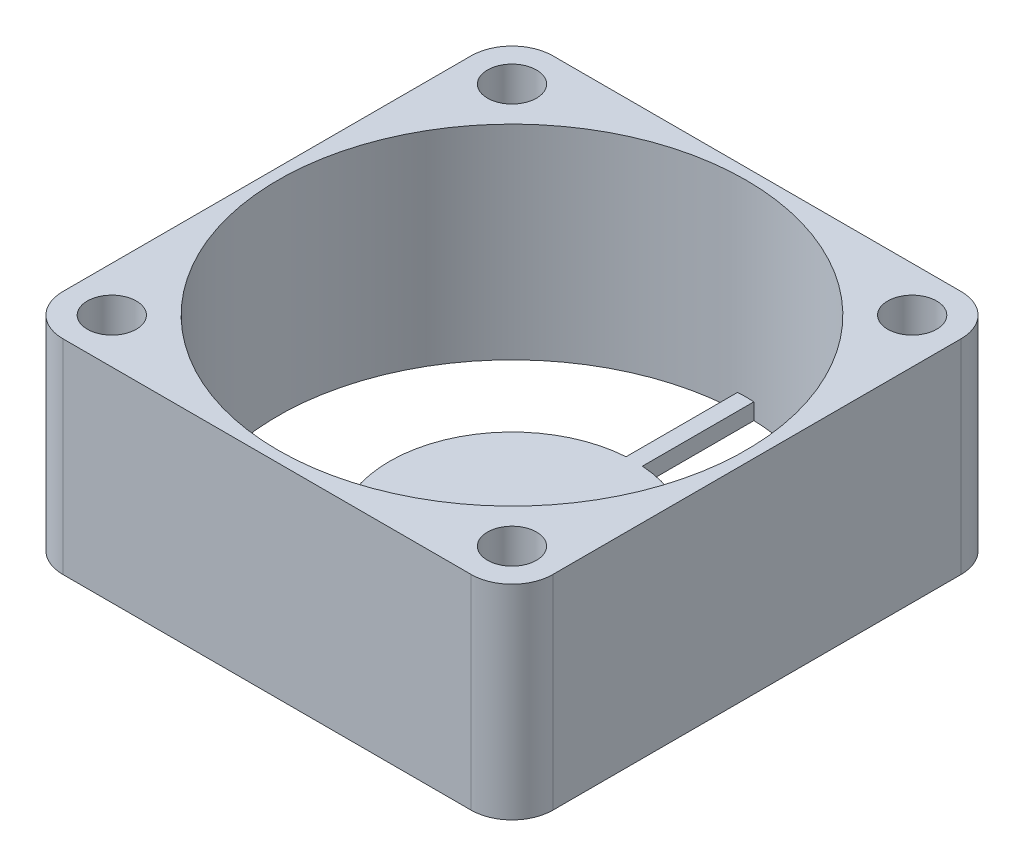
ISO-10303-21;
HEADER;
FILE_DESCRIPTION(('STEP AP214'),'2;1');
FILE_NAME('part.step','',(''),(''),'','','');
FILE_SCHEMA(('AUTOMOTIVE_DESIGN { 1 0 10303 214 1 1 1 1 }'));
ENDSEC;
DATA;
#1=APPLICATION_CONTEXT('core data for automotive mechanical design processes');
#2=APPLICATION_PROTOCOL_DEFINITION('international standard','automotive_design',2000,#1);
#3=PRODUCT_CONTEXT('',#1,'mechanical');
#4=PRODUCT('Part','Part','',(#3));
#5=PRODUCT_RELATED_PRODUCT_CATEGORY('part','',(#4));
#6=PRODUCT_DEFINITION_FORMATION('','',#4);
#7=PRODUCT_DEFINITION_CONTEXT('part definition',#1,'design');
#8=PRODUCT_DEFINITION('design','',#6,#7);
#9=PRODUCT_DEFINITION_SHAPE('','',#8);
#10=(LENGTH_UNIT() NAMED_UNIT(*) SI_UNIT(.MILLI.,.METRE.));
#11=(NAMED_UNIT(*) PLANE_ANGLE_UNIT() SI_UNIT($,.RADIAN.));
#12=(NAMED_UNIT(*) SI_UNIT($,.STERADIAN.) SOLID_ANGLE_UNIT());
#13=UNCERTAINTY_MEASURE_WITH_UNIT(LENGTH_MEASURE(1.E-05),#10,'distance_accuracy_value','');
#14=(GEOMETRIC_REPRESENTATION_CONTEXT(3) GLOBAL_UNCERTAINTY_ASSIGNED_CONTEXT((#13)) GLOBAL_UNIT_ASSIGNED_CONTEXT((#10,
#11,#12)) REPRESENTATION_CONTEXT('',''));
#15=CARTESIAN_POINT('',(0.,0.,0.));
#16=DIRECTION('',(0.,0.,1.));
#17=DIRECTION('',(1.,0.,0.));
#18=AXIS2_PLACEMENT_3D('',#15,#16,#17);
#19=CARTESIAN_POINT('',(0.,35.4678252036913,0.));
#20=DIRECTION('',(0.,-1.,0.));
#21=DIRECTION('',(0.,0.,-1.));
#22=AXIS2_PLACEMENT_3D('',#19,#20,#21);
#23=CYLINDRICAL_SURFACE('',#22,14.3241161390704);
#24=CARTESIAN_POINT('',(0.,1.,0.));
#25=DIRECTION('',(0.,1.,0.));
#26=DIRECTION('',(0.,0.,1.));
#27=AXIS2_PLACEMENT_3D('',#24,#25,#26);
#28=CIRCLE('',#27,14.3241161390704);
#29=CARTESIAN_POINT('',(0.5,1.,-14.3153869373335));
#30=VERTEX_POINT('',#29);
#31=CARTESIAN_POINT('',(-0.5,1.,-14.3153869373335));
#32=VERTEX_POINT('',#31);
#33=EDGE_CURVE('E195',#30,#32,#28,.T.);
#34=ORIENTED_EDGE('',*,*,#33,.F.);
#35=DIRECTION('',(0.,-1.,0.));
#36=VECTOR('',#35,1.);
#37=CARTESIAN_POINT('',(0.5,35.4678252036913,-14.3153869373335));
#38=LINE('',#37,#36);
#39=CARTESIAN_POINT('',(0.5,0.,-14.3153869373335));
#40=VERTEX_POINT('',#39);
#41=EDGE_CURVE('E58',#30,#40,#38,.T.);
#42=ORIENTED_EDGE('',*,*,#41,.T.);
#43=CARTESIAN_POINT('',(0.,0.,0.));
#44=DIRECTION('',(0.,1.,0.));
#45=DIRECTION('',(0.,0.,1.));
#46=AXIS2_PLACEMENT_3D('',#43,#44,#45);
#47=CIRCLE('',#46,14.3241161390704);
#48=CARTESIAN_POINT('',(-0.5,0.,-14.3153869373335));
#49=VERTEX_POINT('',#48);
#50=EDGE_CURVE('E197',#40,#49,#47,.T.);
#51=ORIENTED_EDGE('',*,*,#50,.T.);
#52=DIRECTION('',(0.,-1.,0.));
#53=VECTOR('',#52,1.);
#54=CARTESIAN_POINT('',(-0.5,35.4678252036913,-14.3153869373335));
#55=LINE('',#54,#53);
#56=EDGE_CURVE('E125',#32,#49,#55,.T.);
#57=ORIENTED_EDGE('',*,*,#56,.F.);
#58=EDGE_LOOP('',(#34,#42,#51,#57));
#59=FACE_BOUND('',#58,.T.);
#60=ADVANCED_FACE('F54',(#59),#23,.T.);
#61=CARTESIAN_POINT('',(-0.5,35.4678252036913,0.));
#62=DIRECTION('',(-1.,0.,0.));
#63=DIRECTION('',(0.,0.,1.));
#64=AXIS2_PLACEMENT_3D('',#61,#62,#63);
#65=PLANE('',#64);
#66=DIRECTION('',(0.,-1.,0.));
#67=VECTOR('',#66,1.);
#68=CARTESIAN_POINT('',(-0.5,35.4678252036913,-7.48331477354788));
#69=LINE('',#68,#67);
#70=CARTESIAN_POINT('',(-0.5,1.,-7.48331477354788));
#71=VERTEX_POINT('',#70);
#72=CARTESIAN_POINT('',(-0.5,0.,-7.48331477354788));
#73=VERTEX_POINT('',#72);
#74=EDGE_CURVE('E204',#71,#73,#69,.T.);
#75=ORIENTED_EDGE('',*,*,#74,.F.);
#76=DIRECTION('',(0.,0.,-1.));
#77=VECTOR('',#76,1.);
#78=CARTESIAN_POINT('',(-0.5,1.,0.));
#79=LINE('',#78,#77);
#80=EDGE_CURVE('E132',#71,#32,#79,.T.);
#81=ORIENTED_EDGE('',*,*,#80,.T.);
#82=ORIENTED_EDGE('',*,*,#56,.T.);
#83=DIRECTION('',(0.,0.,-1.));
#84=VECTOR('',#83,1.);
#85=CARTESIAN_POINT('',(-0.5,0.,0.));
#86=LINE('',#85,#84);
#87=EDGE_CURVE('E202',#73,#49,#86,.T.);
#88=ORIENTED_EDGE('',*,*,#87,.F.);
#89=EDGE_LOOP('',(#75,#81,#82,#88));
#90=FACE_BOUND('',#89,.T.);
#91=ADVANCED_FACE('F261',(#90),#65,.T.);
#92=CARTESIAN_POINT('',(0.,35.4678252036913,0.));
#93=DIRECTION('',(0.,-1.,0.));
#94=DIRECTION('',(0.,0.,-1.));
#95=AXIS2_PLACEMENT_3D('',#92,#93,#94);
#96=CYLINDRICAL_SURFACE('',#95,7.5);
#97=CARTESIAN_POINT('',(0.,1.,0.));
#98=DIRECTION('',(0.,1.,0.));
#99=DIRECTION('',(0.,0.,1.));
#100=AXIS2_PLACEMENT_3D('',#97,#98,#99);
#101=CIRCLE('',#100,7.5);
#102=CARTESIAN_POINT('',(-6.73074069840789,1.,3.30864468488166));
#103=VERTEX_POINT('',#102);
#104=EDGE_CURVE('E192',#71,#103,#101,.T.);
#105=ORIENTED_EDGE('',*,*,#104,.F.);
#106=ORIENTED_EDGE('',*,*,#74,.T.);
#107=CARTESIAN_POINT('',(0.,0.,0.));
#108=DIRECTION('',(0.,1.,0.));
#109=DIRECTION('',(0.,0.,1.));
#110=AXIS2_PLACEMENT_3D('',#107,#108,#109);
#111=CIRCLE('',#110,7.5);
#112=CARTESIAN_POINT('',(-6.73074069840789,0.,3.30864468488166));
#113=VERTEX_POINT('',#112);
#114=EDGE_CURVE('E206',#73,#113,#111,.T.);
#115=ORIENTED_EDGE('',*,*,#114,.T.);
#116=DIRECTION('',(0.,-1.,0.));
#117=VECTOR('',#116,1.);
#118=CARTESIAN_POINT('',(-6.73074069840789,35.4678252036913,3.30864468488166));
#119=LINE('',#118,#117);
#120=EDGE_CURVE('E207',#103,#113,#119,.T.);
#121=ORIENTED_EDGE('',*,*,#120,.F.);
#122=EDGE_LOOP('',(#105,#106,#115,#121));
#123=FACE_BOUND('',#122,.T.);
#124=ADVANCED_FACE('F231',(#123),#96,.T.);
#125=CARTESIAN_POINT('',(-0.249999999999996,35.4678252036913,-0.433012701892222));
#126=DIRECTION('',(0.499999999999992,0.,0.866025403784443));
#127=DIRECTION('',(0.866025403784443,0.,-0.499999999999992));
#128=AXIS2_PLACEMENT_3D('',#125,#126,#127);
#129=PLANE('',#128);
#130=DIRECTION('',(-0.866025403784443,0.,0.499999999999992));
#131=VECTOR('',#130,1.);
#132=CARTESIAN_POINT('',(-0.249999999999996,1.,-0.433012701892222));
#133=LINE('',#132,#131);
#134=CARTESIAN_POINT('',(-12.6474887527348,1.,6.7246807667744));
#135=VERTEX_POINT('',#134);
#136=EDGE_CURVE('E189',#103,#135,#133,.T.);
#137=ORIENTED_EDGE('',*,*,#136,.F.);
#138=ORIENTED_EDGE('',*,*,#120,.T.);
#139=DIRECTION('',(-0.866025403784443,0.,0.499999999999992));
#140=VECTOR('',#139,1.);
#141=CARTESIAN_POINT('',(-0.249999999999996,0.,-0.433012701892222));
#142=LINE('',#141,#140);
#143=CARTESIAN_POINT('',(-12.6474887527348,0.,6.7246807667744));
#144=VERTEX_POINT('',#143);
#145=EDGE_CURVE('E209',#113,#144,#142,.T.);
#146=ORIENTED_EDGE('',*,*,#145,.T.);
#147=DIRECTION('',(0.,-1.,0.));
#148=VECTOR('',#147,1.);
#149=CARTESIAN_POINT('',(-12.6474887527348,35.4678252036913,6.7246807667744));
#150=LINE('',#149,#148);
#151=EDGE_CURVE('E210',#135,#144,#150,.T.);
#152=ORIENTED_EDGE('',*,*,#151,.F.);
#153=EDGE_LOOP('',(#137,#138,#146,#152));
#154=FACE_BOUND('',#153,.T.);
#155=ADVANCED_FACE('F268',(#154),#129,.F.);
#156=CARTESIAN_POINT('',(0.,35.4678252036913,0.));
#157=DIRECTION('',(0.,-1.,0.));
#158=DIRECTION('',(0.,0.,-1.));
#159=AXIS2_PLACEMENT_3D('',#156,#157,#158);
#160=CYLINDRICAL_SURFACE('',#159,14.3241161390704);
#161=CARTESIAN_POINT('',(0.,1.,0.));
#162=DIRECTION('',(0.,1.,0.));
#163=DIRECTION('',(0.,0.,1.));
#164=AXIS2_PLACEMENT_3D('',#161,#162,#163);
#165=CIRCLE('',#164,14.3241161390704);
#166=CARTESIAN_POINT('',(-12.1474887527348,1.,7.59070617055884));
#167=VERTEX_POINT('',#166);
#168=EDGE_CURVE('E182',#135,#167,#165,.T.);
#169=ORIENTED_EDGE('',*,*,#168,.F.);
#170=ORIENTED_EDGE('',*,*,#151,.T.);
#171=CARTESIAN_POINT('',(0.,0.,0.));
#172=DIRECTION('',(0.,1.,0.));
#173=DIRECTION('',(0.,0.,1.));
#174=AXIS2_PLACEMENT_3D('',#171,#172,#173);
#175=CIRCLE('',#174,14.3241161390704);
#176=CARTESIAN_POINT('',(-12.1474887527348,0.,7.59070617055884));
#177=VERTEX_POINT('',#176);
#178=EDGE_CURVE('E186',#144,#177,#175,.T.);
#179=ORIENTED_EDGE('',*,*,#178,.T.);
#180=DIRECTION('',(0.,-1.,0.));
#181=VECTOR('',#180,1.);
#182=CARTESIAN_POINT('',(-12.1474887527348,35.4678252036913,7.59070617055884));
#183=LINE('',#182,#181);
#184=EDGE_CURVE('E185',#167,#177,#183,.T.);
#185=ORIENTED_EDGE('',*,*,#184,.F.);
#186=EDGE_LOOP('',(#169,#170,#179,#185));
#187=FACE_BOUND('',#186,.T.);
#188=ADVANCED_FACE('F271',(#187),#160,.T.);
#189=CARTESIAN_POINT('',(0.249999999999996,35.4678252036913,0.433012701892222));
#190=DIRECTION('',(0.499999999999992,0.,0.866025403784443));
#191=DIRECTION('',(0.866025403784443,0.,-0.499999999999992));
#192=AXIS2_PLACEMENT_3D('',#189,#190,#191);
#193=PLANE('',#192);
#194=DIRECTION('',(0.,-1.,0.));
#195=VECTOR('',#194,1.);
#196=CARTESIAN_POINT('',(-6.2307406984079,35.4678252036913,4.1746700886661));
#197=LINE('',#196,#195);
#198=CARTESIAN_POINT('',(-6.2307406984079,1.,4.1746700886661));
#199=VERTEX_POINT('',#198);
#200=CARTESIAN_POINT('',(-6.2307406984079,0.,4.1746700886661));
#201=VERTEX_POINT('',#200);
#202=EDGE_CURVE('E213',#199,#201,#197,.T.);
#203=ORIENTED_EDGE('',*,*,#202,.F.);
#204=DIRECTION('',(-0.866025403784443,0.,0.499999999999992));
#205=VECTOR('',#204,1.);
#206=CARTESIAN_POINT('',(0.249999999999996,1.,0.433012701892222));
#207=LINE('',#206,#205);
#208=EDGE_CURVE('E183',#199,#167,#207,.T.);
#209=ORIENTED_EDGE('',*,*,#208,.T.);
#210=ORIENTED_EDGE('',*,*,#184,.T.);
#211=DIRECTION('',(-0.866025403784443,0.,0.499999999999992));
#212=VECTOR('',#211,1.);
#213=CARTESIAN_POINT('',(0.249999999999996,0.,0.433012701892222));
#214=LINE('',#213,#212);
#215=EDGE_CURVE('E244',#201,#177,#214,.T.);
#216=ORIENTED_EDGE('',*,*,#215,.F.);
#217=EDGE_LOOP('',(#203,#209,#210,#216));
#218=FACE_BOUND('',#217,.T.);
#219=ADVANCED_FACE('F274',(#218),#193,.T.);
#220=CARTESIAN_POINT('',(0.,1.,0.));
#221=DIRECTION('',(0.,1.,0.));
#222=DIRECTION('',(0.,0.,1.));
#223=AXIS2_PLACEMENT_3D('',#220,#221,#222);
#224=CIRCLE('',#223,7.5);
#225=CARTESIAN_POINT('',(6.23074069840784,1.,4.17467008866619));
#226=VERTEX_POINT('',#225);
#227=EDGE_CURVE('E179',#199,#226,#224,.T.);
#228=ORIENTED_EDGE('',*,*,#227,.F.);
#229=ORIENTED_EDGE('',*,*,#202,.T.);
#230=CARTESIAN_POINT('',(6.23074069840784,0.,4.17467008866619));
#231=VERTEX_POINT('',#230);
#232=EDGE_CURVE('E215',#201,#231,#111,.T.);
#233=ORIENTED_EDGE('',*,*,#232,.T.);
#234=DIRECTION('',(0.,-1.,0.));
#235=VECTOR('',#234,1.);
#236=CARTESIAN_POINT('',(6.23074069840784,35.4678252036913,4.17467008866619));
#237=LINE('',#236,#235);
#238=EDGE_CURVE('E216',#226,#231,#237,.T.);
#239=ORIENTED_EDGE('',*,*,#238,.F.);
#240=EDGE_LOOP('',(#228,#229,#233,#239));
#241=FACE_BOUND('',#240,.T.);
#242=ADVANCED_FACE('F259',(#241),#96,.T.);
#243=CARTESIAN_POINT('',(-0.250000000000002,35.4678252036913,0.433012701892218));
#244=DIRECTION('',(0.500000000000004,0.,-0.866025403784436));
#245=DIRECTION('',(-0.866025403784436,0.,-0.500000000000004));
#246=AXIS2_PLACEMENT_3D('',#243,#244,#245);
#247=PLANE('',#246);
#248=DIRECTION('',(0.866025403784436,0.,0.500000000000004));
#249=VECTOR('',#248,1.);
#250=CARTESIAN_POINT('',(-0.250000000000002,1.,0.433012701892218));
#251=LINE('',#250,#249);
#252=CARTESIAN_POINT('',(12.1474887527347,1.,7.59070617055901));
#253=VERTEX_POINT('',#252);
#254=EDGE_CURVE('E177',#226,#253,#251,.T.);
#255=ORIENTED_EDGE('',*,*,#254,.F.);
#256=ORIENTED_EDGE('',*,*,#238,.T.);
#257=DIRECTION('',(0.866025403784436,0.,0.500000000000004));
#258=VECTOR('',#257,1.);
#259=CARTESIAN_POINT('',(-0.250000000000002,0.,0.433012701892218));
#260=LINE('',#259,#258);
#261=CARTESIAN_POINT('',(12.1474887527347,0.,7.59070617055901));
#262=VERTEX_POINT('',#261);
#263=EDGE_CURVE('E218',#231,#262,#260,.T.);
#264=ORIENTED_EDGE('',*,*,#263,.T.);
#265=DIRECTION('',(0.,-1.,0.));
#266=VECTOR('',#265,1.);
#267=CARTESIAN_POINT('',(12.1474887527347,35.4678252036913,7.59070617055901));
#268=LINE('',#267,#266);
#269=EDGE_CURVE('E172',#253,#262,#268,.T.);
#270=ORIENTED_EDGE('',*,*,#269,.F.);
#271=EDGE_LOOP('',(#255,#256,#264,#270));
#272=FACE_BOUND('',#271,.T.);
#273=ADVANCED_FACE('F279',(#272),#247,.F.);
#274=CARTESIAN_POINT('',(0.,35.4678252036913,0.));
#275=DIRECTION('',(0.,-1.,0.));
#276=DIRECTION('',(0.,0.,-1.));
#277=AXIS2_PLACEMENT_3D('',#274,#275,#276);
#278=CYLINDRICAL_SURFACE('',#277,14.3241161390704);
#279=CARTESIAN_POINT('',(0.,1.,0.));
#280=DIRECTION('',(0.,1.,0.));
#281=DIRECTION('',(0.,0.,1.));
#282=AXIS2_PLACEMENT_3D('',#279,#280,#281);
#283=CIRCLE('',#282,14.3241161390704);
#284=CARTESIAN_POINT('',(12.6474887527347,1.,6.72468076677458));
#285=VERTEX_POINT('',#284);
#286=EDGE_CURVE('E63',#253,#285,#283,.T.);
#287=ORIENTED_EDGE('',*,*,#286,.F.);
#288=ORIENTED_EDGE('',*,*,#269,.T.);
#289=CARTESIAN_POINT('',(0.,0.,0.));
#290=DIRECTION('',(0.,1.,0.));
#291=DIRECTION('',(0.,0.,1.));
#292=AXIS2_PLACEMENT_3D('',#289,#290,#291);
#293=CIRCLE('',#292,14.3241161390704);
#294=CARTESIAN_POINT('',(12.6474887527347,0.,6.72468076677458));
#295=VERTEX_POINT('',#294);
#296=EDGE_CURVE('E168',#262,#295,#293,.T.);
#297=ORIENTED_EDGE('',*,*,#296,.T.);
#298=DIRECTION('',(0.,-1.,0.));
#299=VECTOR('',#298,1.);
#300=CARTESIAN_POINT('',(12.6474887527347,35.4678252036913,6.72468076677458));
#301=LINE('',#300,#299);
#302=EDGE_CURVE('E164',#285,#295,#301,.T.);
#303=ORIENTED_EDGE('',*,*,#302,.F.);
#304=EDGE_LOOP('',(#287,#288,#297,#303));
#305=FACE_BOUND('',#304,.T.);
#306=ADVANCED_FACE('F282',(#305),#278,.T.);
#307=CARTESIAN_POINT('',(0.250000000000003,35.4678252036913,-0.433012701892219));
#308=DIRECTION('',(0.500000000000004,0.,-0.866025403784436));
#309=DIRECTION('',(-0.866025403784436,0.,-0.500000000000004));
#310=AXIS2_PLACEMENT_3D('',#307,#308,#309);
#311=PLANE('',#310);
#312=DIRECTION('',(0.,-1.,0.));
#313=VECTOR('',#312,1.);
#314=CARTESIAN_POINT('',(6.73074069840785,35.4678252036913,3.30864468488175));
#315=LINE('',#314,#313);
#316=CARTESIAN_POINT('',(6.73074069840785,1.,3.30864468488175));
#317=VERTEX_POINT('',#316);
#318=CARTESIAN_POINT('',(6.73074069840785,0.,3.30864468488175));
#319=VERTEX_POINT('',#318);
#320=EDGE_CURVE('E151',#317,#319,#315,.T.);
#321=ORIENTED_EDGE('',*,*,#320,.F.);
#322=DIRECTION('',(0.866025403784436,0.,0.500000000000004));
#323=VECTOR('',#322,1.);
#324=CARTESIAN_POINT('',(0.250000000000003,1.,-0.433012701892219));
#325=LINE('',#324,#323);
#326=EDGE_CURVE('E159',#317,#285,#325,.T.);
#327=ORIENTED_EDGE('',*,*,#326,.T.);
#328=ORIENTED_EDGE('',*,*,#302,.T.);
#329=DIRECTION('',(0.866025403784436,0.,0.500000000000004));
#330=VECTOR('',#329,1.);
#331=CARTESIAN_POINT('',(0.250000000000003,0.,-0.433012701892219));
#332=LINE('',#331,#330);
#333=EDGE_CURVE('E162',#319,#295,#332,.T.);
#334=ORIENTED_EDGE('',*,*,#333,.F.);
#335=EDGE_LOOP('',(#321,#327,#328,#334));
#336=FACE_BOUND('',#335,.T.);
#337=ADVANCED_FACE('F158',(#336),#311,.T.);
#338=CARTESIAN_POINT('',(0.,1.,0.));
#339=DIRECTION('',(0.,1.,0.));
#340=DIRECTION('',(0.,0.,1.));
#341=AXIS2_PLACEMENT_3D('',#338,#339,#340);
#342=CIRCLE('',#341,7.5);
#343=CARTESIAN_POINT('',(0.5,1.,-7.48331477354788));
#344=VERTEX_POINT('',#343);
#345=EDGE_CURVE('E12',#317,#344,#342,.T.);
#346=ORIENTED_EDGE('',*,*,#345,.F.);
#347=ORIENTED_EDGE('',*,*,#320,.T.);
#348=CARTESIAN_POINT('',(0.5,0.,-7.48331477354788));
#349=VERTEX_POINT('',#348);
#350=EDGE_CURVE('E163',#319,#349,#111,.T.);
#351=ORIENTED_EDGE('',*,*,#350,.T.);
#352=DIRECTION('',(0.,-1.,0.));
#353=VECTOR('',#352,1.);
#354=CARTESIAN_POINT('',(0.5,35.4678252036913,-7.48331477354788));
#355=LINE('',#354,#353);
#356=EDGE_CURVE('E76',#344,#349,#355,.T.);
#357=ORIENTED_EDGE('',*,*,#356,.F.);
#358=EDGE_LOOP('',(#346,#347,#351,#357));
#359=FACE_BOUND('',#358,.T.);
#360=ADVANCED_FACE('F150',(#359),#96,.T.);
#361=CARTESIAN_POINT('',(0.5,35.4678252036913,0.));
#362=DIRECTION('',(-1.,0.,0.));
#363=DIRECTION('',(0.,0.,1.));
#364=AXIS2_PLACEMENT_3D('',#361,#362,#363);
#365=PLANE('',#364);
#366=DIRECTION('',(0.,0.,-1.));
#367=VECTOR('',#366,1.);
#368=CARTESIAN_POINT('',(0.5,1.,0.));
#369=LINE('',#368,#367);
#370=EDGE_CURVE('E200',#344,#30,#369,.T.);
#371=ORIENTED_EDGE('',*,*,#370,.F.);
#372=ORIENTED_EDGE('',*,*,#356,.T.);
#373=DIRECTION('',(0.,0.,-1.));
#374=VECTOR('',#373,1.);
#375=CARTESIAN_POINT('',(0.5,0.,0.));
#376=LINE('',#375,#374);
#377=EDGE_CURVE('E219',#349,#40,#376,.T.);
#378=ORIENTED_EDGE('',*,*,#377,.T.);
#379=ORIENTED_EDGE('',*,*,#41,.F.);
#380=EDGE_LOOP('',(#371,#372,#378,#379));
#381=FACE_BOUND('',#380,.T.);
#382=ADVANCED_FACE('F250',(#381),#365,.F.);
#383=CARTESIAN_POINT('',(0.,0.,0.));
#384=DIRECTION('',(0.,1.,0.));
#385=DIRECTION('',(0.,0.,1.));
#386=AXIS2_PLACEMENT_3D('',#383,#384,#385);
#387=PLANE('',#386);
#388=ORIENTED_EDGE('',*,*,#50,.F.);
#389=ORIENTED_EDGE('',*,*,#377,.F.);
#390=ORIENTED_EDGE('',*,*,#350,.F.);
#391=ORIENTED_EDGE('',*,*,#333,.T.);
#392=ORIENTED_EDGE('',*,*,#296,.F.);
#393=ORIENTED_EDGE('',*,*,#263,.F.);
#394=ORIENTED_EDGE('',*,*,#232,.F.);
#395=ORIENTED_EDGE('',*,*,#215,.T.);
#396=ORIENTED_EDGE('',*,*,#178,.F.);
#397=ORIENTED_EDGE('',*,*,#145,.F.);
#398=ORIENTED_EDGE('',*,*,#114,.F.);
#399=ORIENTED_EDGE('',*,*,#87,.T.);
#400=EDGE_LOOP('',(#388,#389,#390,#391,#392,#393,#394,#395,#396,#397,#398,#399));
#401=FACE_BOUND('',#400,.T.);
#402=ADVANCED_FACE('F237',(#401),#387,.F.);
#403=CARTESIAN_POINT('',(0.,1.,0.));
#404=DIRECTION('',(0.,1.,0.));
#405=DIRECTION('',(0.,0.,1.));
#406=AXIS2_PLACEMENT_3D('',#403,#404,#405);
#407=PLANE('',#406);
#408=ORIENTED_EDGE('',*,*,#370,.T.);
#409=ORIENTED_EDGE('',*,*,#33,.T.);
#410=ORIENTED_EDGE('',*,*,#80,.F.);
#411=ORIENTED_EDGE('',*,*,#104,.T.);
#412=ORIENTED_EDGE('',*,*,#136,.T.);
#413=ORIENTED_EDGE('',*,*,#168,.T.);
#414=ORIENTED_EDGE('',*,*,#208,.F.);
#415=ORIENTED_EDGE('',*,*,#227,.T.);
#416=ORIENTED_EDGE('',*,*,#254,.T.);
#417=ORIENTED_EDGE('',*,*,#286,.T.);
#418=ORIENTED_EDGE('',*,*,#326,.F.);
#419=ORIENTED_EDGE('',*,*,#345,.T.);
#420=EDGE_LOOP('',(#408,#409,#410,#411,#412,#413,#414,#415,#416,#417,#418,#419));
#421=FACE_BOUND('',#420,.T.);
#422=ADVANCED_FACE('F56',(#421),#407,.T.);
#423=CLOSED_SHELL('',(#60,#91,#124,#155,#188,#219,#242,#273,#306,#337,#360,#382,#402,#422));
#424=MANIFOLD_SOLID_BREP('B2',#423);
#425=CARTESIAN_POINT('',(15.,12.5,0.));
#426=DIRECTION('',(1.,0.,0.));
#427=DIRECTION('',(0.,0.,-1.));
#428=AXIS2_PLACEMENT_3D('',#425,#426,#427);
#429=PLANE('',#428);
#430=DIRECTION('',(0.,0.,1.));
#431=VECTOR('',#430,1.);
#432=CARTESIAN_POINT('',(15.,0.,0.));
#433=LINE('',#432,#431);
#434=CARTESIAN_POINT('',(15.,0.,-12.5));
#435=VERTEX_POINT('',#434);
#436=CARTESIAN_POINT('',(15.,0.,12.5));
#437=VERTEX_POINT('',#436);
#438=EDGE_CURVE('E501',#435,#437,#433,.T.);
#439=ORIENTED_EDGE('',*,*,#438,.F.);
#440=DIRECTION('',(0.,-1.,0.));
#441=VECTOR('',#440,1.);
#442=CARTESIAN_POINT('',(15.,12.5,-12.5));
#443=LINE('',#442,#441);
#444=CARTESIAN_POINT('',(15.,12.5,-12.5));
#445=VERTEX_POINT('',#444);
#446=EDGE_CURVE('E523',#435,#445,#443,.F.);
#447=ORIENTED_EDGE('',*,*,#446,.T.);
#448=DIRECTION('',(0.,0.,1.));
#449=VECTOR('',#448,1.);
#450=CARTESIAN_POINT('',(15.,12.5,0.));
#451=LINE('',#450,#449);
#452=CARTESIAN_POINT('',(15.,12.5,12.5));
#453=VERTEX_POINT('',#452);
#454=EDGE_CURVE('E529',#445,#453,#451,.T.);
#455=ORIENTED_EDGE('',*,*,#454,.T.);
#456=DIRECTION('',(0.,-1.,0.));
#457=VECTOR('',#456,1.);
#458=CARTESIAN_POINT('',(15.,0.,12.5));
#459=LINE('',#458,#457);
#460=EDGE_CURVE('E520',#453,#437,#459,.T.);
#461=ORIENTED_EDGE('',*,*,#460,.T.);
#462=EDGE_LOOP('',(#439,#447,#455,#461));
#463=FACE_BOUND('',#462,.T.);
#464=ADVANCED_FACE('F404',(#463),#429,.T.);
#465=CARTESIAN_POINT('',(0.,12.5,-15.));
#466=DIRECTION('',(0.,0.,-1.));
#467=DIRECTION('',(-1.,0.,0.));
#468=AXIS2_PLACEMENT_3D('',#465,#466,#467);
#469=PLANE('',#468);
#470=DIRECTION('',(1.,0.,0.));
#471=VECTOR('',#470,1.);
#472=CARTESIAN_POINT('',(0.,0.,-15.));
#473=LINE('',#472,#471);
#474=CARTESIAN_POINT('',(-12.5,0.,-15.));
#475=VERTEX_POINT('',#474);
#476=CARTESIAN_POINT('',(12.5,0.,-15.));
#477=VERTEX_POINT('',#476);
#478=EDGE_CURVE('E497',#475,#477,#473,.T.);
#479=ORIENTED_EDGE('',*,*,#478,.F.);
#480=DIRECTION('',(0.,-1.,0.));
#481=VECTOR('',#480,1.);
#482=CARTESIAN_POINT('',(-12.5,12.5,-15.));
#483=LINE('',#482,#481);
#484=CARTESIAN_POINT('',(-12.5,12.5,-15.));
#485=VERTEX_POINT('',#484);
#486=EDGE_CURVE('E475',#475,#485,#483,.F.);
#487=ORIENTED_EDGE('',*,*,#486,.T.);
#488=DIRECTION('',(1.,0.,0.));
#489=VECTOR('',#488,1.);
#490=CARTESIAN_POINT('',(0.,12.5,-15.));
#491=LINE('',#490,#489);
#492=CARTESIAN_POINT('',(12.5,12.5,-15.));
#493=VERTEX_POINT('',#492);
#494=EDGE_CURVE('E538',#485,#493,#491,.T.);
#495=ORIENTED_EDGE('',*,*,#494,.T.);
#496=DIRECTION('',(0.,-1.,0.));
#497=VECTOR('',#496,1.);
#498=CARTESIAN_POINT('',(12.5,12.5,-15.));
#499=LINE('',#498,#497);
#500=EDGE_CURVE('E480',#493,#477,#499,.T.);
#501=ORIENTED_EDGE('',*,*,#500,.T.);
#502=EDGE_LOOP('',(#479,#487,#495,#501));
#503=FACE_BOUND('',#502,.T.);
#504=ADVANCED_FACE('F544',(#503),#469,.T.);
#505=CARTESIAN_POINT('',(-15.,12.5,0.));
#506=DIRECTION('',(1.,0.,0.));
#507=DIRECTION('',(0.,0.,-1.));
#508=AXIS2_PLACEMENT_3D('',#505,#506,#507);
#509=PLANE('',#508);
#510=DIRECTION('',(0.,0.,1.));
#511=VECTOR('',#510,1.);
#512=CARTESIAN_POINT('',(-15.,12.5,0.));
#513=LINE('',#512,#511);
#514=CARTESIAN_POINT('',(-15.,12.5,-12.5));
#515=VERTEX_POINT('',#514);
#516=CARTESIAN_POINT('',(-15.,12.5,12.5));
#517=VERTEX_POINT('',#516);
#518=EDGE_CURVE('E489',#515,#517,#513,.T.);
#519=ORIENTED_EDGE('',*,*,#518,.F.);
#520=DIRECTION('',(0.,-1.,0.));
#521=VECTOR('',#520,1.);
#522=CARTESIAN_POINT('',(-15.,0.,-12.5));
#523=LINE('',#522,#521);
#524=CARTESIAN_POINT('',(-15.,0.,-12.5));
#525=VERTEX_POINT('',#524);
#526=EDGE_CURVE('E474',#515,#525,#523,.T.);
#527=ORIENTED_EDGE('',*,*,#526,.T.);
#528=DIRECTION('',(0.,0.,1.));
#529=VECTOR('',#528,1.);
#530=CARTESIAN_POINT('',(-15.,0.,0.));
#531=LINE('',#530,#529);
#532=CARTESIAN_POINT('',(-15.,0.,12.5));
#533=VERTEX_POINT('',#532);
#534=EDGE_CURVE('E487',#525,#533,#531,.T.);
#535=ORIENTED_EDGE('',*,*,#534,.T.);
#536=DIRECTION('',(0.,-1.,0.));
#537=VECTOR('',#536,1.);
#538=CARTESIAN_POINT('',(-15.,12.5,12.5));
#539=LINE('',#538,#537);
#540=EDGE_CURVE('E491',#533,#517,#539,.F.);
#541=ORIENTED_EDGE('',*,*,#540,.T.);
#542=EDGE_LOOP('',(#519,#527,#535,#541));
#543=FACE_BOUND('',#542,.T.);
#544=ADVANCED_FACE('F486',(#543),#509,.F.);
#545=CARTESIAN_POINT('',(12.25,12.5,-12.25));
#546=DIRECTION('',(0.,-1.,0.));
#547=DIRECTION('',(0.,0.,-1.));
#548=AXIS2_PLACEMENT_3D('',#545,#546,#547);
#549=CYLINDRICAL_SURFACE('',#548,1.5);
#550=CARTESIAN_POINT('',(12.25,12.5,-12.25));
#551=DIRECTION('',(0.,1.,0.));
#552=DIRECTION('',(0.,0.,1.));
#553=AXIS2_PLACEMENT_3D('',#550,#551,#552);
#554=CIRCLE('',#553,1.5);
#555=CARTESIAN_POINT('',(12.25,12.5,-10.75));
#556=VERTEX_POINT('',#555);
#557=EDGE_CURVE('E539',#556,#556,#554,.T.);
#558=ORIENTED_EDGE('',*,*,#557,.T.);
#559=EDGE_LOOP('',(#558));
#560=FACE_BOUND('',#559,.T.);
#561=CARTESIAN_POINT('',(12.25,0.,-12.25));
#562=DIRECTION('',(0.,1.,0.));
#563=DIRECTION('',(0.,0.,1.));
#564=AXIS2_PLACEMENT_3D('',#561,#562,#563);
#565=CIRCLE('',#564,1.5);
#566=CARTESIAN_POINT('',(12.25,0.,-10.75));
#567=VERTEX_POINT('',#566);
#568=EDGE_CURVE('E545',#567,#567,#565,.T.);
#569=ORIENTED_EDGE('',*,*,#568,.F.);
#570=EDGE_LOOP('',(#569));
#571=FACE_BOUND('',#570,.T.);
#572=ADVANCED_FACE('F593',(#560,#571),#549,.F.);
#573=CARTESIAN_POINT('',(12.25,12.5,12.25));
#574=DIRECTION('',(0.,-1.,0.));
#575=DIRECTION('',(0.,0.,-1.));
#576=AXIS2_PLACEMENT_3D('',#573,#574,#575);
#577=CYLINDRICAL_SURFACE('',#576,1.5);
#578=CARTESIAN_POINT('',(12.25,12.5,12.25));
#579=DIRECTION('',(0.,1.,0.));
#580=DIRECTION('',(0.,0.,1.));
#581=AXIS2_PLACEMENT_3D('',#578,#579,#580);
#582=CIRCLE('',#581,1.5);
#583=CARTESIAN_POINT('',(12.25,12.5,13.75));
#584=VERTEX_POINT('',#583);
#585=EDGE_CURVE('E566',#584,#584,#582,.T.);
#586=ORIENTED_EDGE('',*,*,#585,.T.);
#587=EDGE_LOOP('',(#586));
#588=FACE_BOUND('',#587,.T.);
#589=CARTESIAN_POINT('',(12.25,0.,12.25));
#590=DIRECTION('',(0.,1.,0.));
#591=DIRECTION('',(0.,0.,1.));
#592=AXIS2_PLACEMENT_3D('',#589,#590,#591);
#593=CIRCLE('',#592,1.5);
#594=CARTESIAN_POINT('',(12.25,0.,13.75));
#595=VERTEX_POINT('',#594);
#596=EDGE_CURVE('E547',#595,#595,#593,.T.);
#597=ORIENTED_EDGE('',*,*,#596,.F.);
#598=EDGE_LOOP('',(#597));
#599=FACE_BOUND('',#598,.T.);
#600=ADVANCED_FACE('F596',(#588,#599),#577,.F.);
#601=CARTESIAN_POINT('',(-12.25,12.5,-12.25));
#602=DIRECTION('',(0.,-1.,0.));
#603=DIRECTION('',(0.,0.,-1.));
#604=AXIS2_PLACEMENT_3D('',#601,#602,#603);
#605=CYLINDRICAL_SURFACE('',#604,1.5);
#606=CARTESIAN_POINT('',(-12.25,12.5,-12.25));
#607=DIRECTION('',(0.,1.,0.));
#608=DIRECTION('',(0.,0.,1.));
#609=AXIS2_PLACEMENT_3D('',#606,#607,#608);
#610=CIRCLE('',#609,1.5);
#611=CARTESIAN_POINT('',(-12.25,12.5,-10.75));
#612=VERTEX_POINT('',#611);
#613=EDGE_CURVE('E569',#612,#612,#610,.T.);
#614=ORIENTED_EDGE('',*,*,#613,.T.);
#615=EDGE_LOOP('',(#614));
#616=FACE_BOUND('',#615,.T.);
#617=CARTESIAN_POINT('',(-12.25,0.,-12.25));
#618=DIRECTION('',(0.,1.,0.));
#619=DIRECTION('',(0.,0.,1.));
#620=AXIS2_PLACEMENT_3D('',#617,#618,#619);
#621=CIRCLE('',#620,1.5);
#622=CARTESIAN_POINT('',(-12.25,0.,-10.75));
#623=VERTEX_POINT('',#622);
#624=EDGE_CURVE('E552',#623,#623,#621,.T.);
#625=ORIENTED_EDGE('',*,*,#624,.F.);
#626=EDGE_LOOP('',(#625));
#627=FACE_BOUND('',#626,.T.);
#628=ADVANCED_FACE('F620',(#616,#627),#605,.F.);
#629=CARTESIAN_POINT('',(-12.25,12.5,12.25));
#630=DIRECTION('',(0.,-1.,0.));
#631=DIRECTION('',(0.,0.,-1.));
#632=AXIS2_PLACEMENT_3D('',#629,#630,#631);
#633=CYLINDRICAL_SURFACE('',#632,1.5);
#634=CARTESIAN_POINT('',(-12.25,12.5,12.25));
#635=DIRECTION('',(0.,1.,0.));
#636=DIRECTION('',(0.,0.,1.));
#637=AXIS2_PLACEMENT_3D('',#634,#635,#636);
#638=CIRCLE('',#637,1.5);
#639=CARTESIAN_POINT('',(-12.25,12.5,13.75));
#640=VERTEX_POINT('',#639);
#641=EDGE_CURVE('E572',#640,#640,#638,.T.);
#642=ORIENTED_EDGE('',*,*,#641,.T.);
#643=EDGE_LOOP('',(#642));
#644=FACE_BOUND('',#643,.T.);
#645=CARTESIAN_POINT('',(-12.25,0.,12.25));
#646=DIRECTION('',(0.,1.,0.));
#647=DIRECTION('',(0.,0.,1.));
#648=AXIS2_PLACEMENT_3D('',#645,#646,#647);
#649=CIRCLE('',#648,1.5);
#650=CARTESIAN_POINT('',(-12.25,0.,13.75));
#651=VERTEX_POINT('',#650);
#652=EDGE_CURVE('E555',#651,#651,#649,.T.);
#653=ORIENTED_EDGE('',*,*,#652,.F.);
#654=EDGE_LOOP('',(#653));
#655=FACE_BOUND('',#654,.T.);
#656=ADVANCED_FACE('F624',(#644,#655),#633,.F.);
#657=CARTESIAN_POINT('',(0.,12.5,0.));
#658=DIRECTION('',(0.,-1.,0.));
#659=DIRECTION('',(0.,0.,-1.));
#660=AXIS2_PLACEMENT_3D('',#657,#658,#659);
#661=CYLINDRICAL_SURFACE('',#660,14.3241161390704);
#662=CARTESIAN_POINT('',(0.,12.5,0.));
#663=DIRECTION('',(0.,1.,0.));
#664=DIRECTION('',(0.,0.,1.));
#665=AXIS2_PLACEMENT_3D('',#662,#663,#664);
#666=CIRCLE('',#665,14.3241161390704);
#667=CARTESIAN_POINT('',(0.,12.5,14.3241161390704));
#668=VERTEX_POINT('',#667);
#669=EDGE_CURVE('E499',#668,#668,#666,.T.);
#670=ORIENTED_EDGE('',*,*,#669,.T.);
#671=EDGE_LOOP('',(#670));
#672=FACE_BOUND('',#671,.T.);
#673=CARTESIAN_POINT('',(0.,0.,0.));
#674=DIRECTION('',(0.,1.,0.));
#675=DIRECTION('',(0.,0.,1.));
#676=AXIS2_PLACEMENT_3D('',#673,#674,#675);
#677=CIRCLE('',#676,14.3241161390704);
#678=CARTESIAN_POINT('',(0.,0.,14.3241161390704));
#679=VERTEX_POINT('',#678);
#680=EDGE_CURVE('E558',#679,#679,#677,.T.);
#681=ORIENTED_EDGE('',*,*,#680,.F.);
#682=EDGE_LOOP('',(#681));
#683=FACE_BOUND('',#682,.T.);
#684=ADVANCED_FACE('F578',(#672,#683),#661,.F.);
#685=CARTESIAN_POINT('',(0.,12.5,15.));
#686=DIRECTION('',(0.,0.,-1.));
#687=DIRECTION('',(-1.,0.,0.));
#688=AXIS2_PLACEMENT_3D('',#685,#686,#687);
#689=PLANE('',#688);
#690=DIRECTION('',(1.,0.,0.));
#691=VECTOR('',#690,1.);
#692=CARTESIAN_POINT('',(0.,12.5,15.));
#693=LINE('',#692,#691);
#694=CARTESIAN_POINT('',(-12.5,12.5,15.));
#695=VERTEX_POINT('',#694);
#696=CARTESIAN_POINT('',(12.5,12.5,15.));
#697=VERTEX_POINT('',#696);
#698=EDGE_CURVE('E505',#695,#697,#693,.T.);
#699=ORIENTED_EDGE('',*,*,#698,.F.);
#700=DIRECTION('',(0.,-1.,0.));
#701=VECTOR('',#700,1.);
#702=CARTESIAN_POINT('',(-12.5,12.5,15.));
#703=LINE('',#702,#701);
#704=CARTESIAN_POINT('',(-12.5,0.,15.));
#705=VERTEX_POINT('',#704);
#706=EDGE_CURVE('E52',#695,#705,#703,.T.);
#707=ORIENTED_EDGE('',*,*,#706,.T.);
#708=DIRECTION('',(1.,0.,0.));
#709=VECTOR('',#708,1.);
#710=CARTESIAN_POINT('',(0.,0.,15.));
#711=LINE('',#710,#709);
#712=CARTESIAN_POINT('',(12.5,0.,15.));
#713=VERTEX_POINT('',#712);
#714=EDGE_CURVE('E496',#705,#713,#711,.T.);
#715=ORIENTED_EDGE('',*,*,#714,.T.);
#716=DIRECTION('',(0.,-1.,0.));
#717=VECTOR('',#716,1.);
#718=CARTESIAN_POINT('',(12.5,12.5,15.));
#719=LINE('',#718,#717);
#720=EDGE_CURVE('E412',#713,#697,#719,.F.);
#721=ORIENTED_EDGE('',*,*,#720,.T.);
#722=EDGE_LOOP('',(#699,#707,#715,#721));
#723=FACE_BOUND('',#722,.T.);
#724=ADVANCED_FACE('F583',(#723),#689,.F.);
#725=CARTESIAN_POINT('',(0.,12.5,0.));
#726=DIRECTION('',(0.,1.,0.));
#727=DIRECTION('',(0.,0.,1.));
#728=AXIS2_PLACEMENT_3D('',#725,#726,#727);
#729=PLANE('',#728);
#730=ORIENTED_EDGE('',*,*,#669,.F.);
#731=EDGE_LOOP('',(#730));
#732=FACE_BOUND('',#731,.T.);
#733=ORIENTED_EDGE('',*,*,#641,.F.);
#734=EDGE_LOOP('',(#733));
#735=FACE_BOUND('',#734,.T.);
#736=ORIENTED_EDGE('',*,*,#613,.F.);
#737=EDGE_LOOP('',(#736));
#738=FACE_BOUND('',#737,.T.);
#739=ORIENTED_EDGE('',*,*,#585,.F.);
#740=EDGE_LOOP('',(#739));
#741=FACE_BOUND('',#740,.T.);
#742=ORIENTED_EDGE('',*,*,#557,.F.);
#743=EDGE_LOOP('',(#742));
#744=FACE_BOUND('',#743,.T.);
#745=ORIENTED_EDGE('',*,*,#494,.F.);
#746=CARTESIAN_POINT('',(-12.5,12.5,-12.5));
#747=DIRECTION('',(0.,1.,0.));
#748=DIRECTION('',(0.,0.,1.));
#749=AXIS2_PLACEMENT_3D('',#746,#747,#748);
#750=CIRCLE('',#749,2.5);
#751=EDGE_CURVE('E518',#485,#515,#750,.T.);
#752=ORIENTED_EDGE('',*,*,#751,.T.);
#753=ORIENTED_EDGE('',*,*,#518,.T.);
#754=CARTESIAN_POINT('',(-12.5,12.5,12.5));
#755=DIRECTION('',(0.,1.,0.));
#756=DIRECTION('',(0.,0.,1.));
#757=AXIS2_PLACEMENT_3D('',#754,#755,#756);
#758=CIRCLE('',#757,2.5);
#759=EDGE_CURVE('E425',#517,#695,#758,.T.);
#760=ORIENTED_EDGE('',*,*,#759,.T.);
#761=ORIENTED_EDGE('',*,*,#698,.T.);
#762=CARTESIAN_POINT('',(12.5,12.5,12.5));
#763=DIRECTION('',(0.,1.,0.));
#764=DIRECTION('',(0.,0.,1.));
#765=AXIS2_PLACEMENT_3D('',#762,#763,#764);
#766=CIRCLE('',#765,2.5);
#767=EDGE_CURVE('E513',#697,#453,#766,.T.);
#768=ORIENTED_EDGE('',*,*,#767,.T.);
#769=ORIENTED_EDGE('',*,*,#454,.F.);
#770=CARTESIAN_POINT('',(12.5,12.5,-12.5));
#771=DIRECTION('',(0.,1.,0.));
#772=DIRECTION('',(0.,0.,1.));
#773=AXIS2_PLACEMENT_3D('',#770,#771,#772);
#774=CIRCLE('',#773,2.5);
#775=EDGE_CURVE('E516',#445,#493,#774,.T.);
#776=ORIENTED_EDGE('',*,*,#775,.T.);
#777=EDGE_LOOP('',(#745,#752,#753,#760,#761,#768,#769,#776));
#778=FACE_BOUND('',#777,.T.);
#779=ADVANCED_FACE('F535',(#732,#735,#738,#741,#744,#778),#729,.T.);
#780=CARTESIAN_POINT('',(0.,0.,0.));
#781=DIRECTION('',(0.,1.,0.));
#782=DIRECTION('',(0.,0.,1.));
#783=AXIS2_PLACEMENT_3D('',#780,#781,#782);
#784=PLANE('',#783);
#785=ORIENTED_EDGE('',*,*,#680,.T.);
#786=EDGE_LOOP('',(#785));
#787=FACE_BOUND('',#786,.T.);
#788=ORIENTED_EDGE('',*,*,#652,.T.);
#789=EDGE_LOOP('',(#788));
#790=FACE_BOUND('',#789,.T.);
#791=ORIENTED_EDGE('',*,*,#624,.T.);
#792=EDGE_LOOP('',(#791));
#793=FACE_BOUND('',#792,.T.);
#794=ORIENTED_EDGE('',*,*,#596,.T.);
#795=EDGE_LOOP('',(#794));
#796=FACE_BOUND('',#795,.T.);
#797=ORIENTED_EDGE('',*,*,#568,.T.);
#798=EDGE_LOOP('',(#797));
#799=FACE_BOUND('',#798,.T.);
#800=ORIENTED_EDGE('',*,*,#534,.F.);
#801=CARTESIAN_POINT('',(-12.5,0.,-12.5));
#802=DIRECTION('',(0.,1.,0.));
#803=DIRECTION('',(0.,0.,1.));
#804=AXIS2_PLACEMENT_3D('',#801,#802,#803);
#805=CIRCLE('',#804,2.5);
#806=EDGE_CURVE('E470',#525,#475,#805,.F.);
#807=ORIENTED_EDGE('',*,*,#806,.T.);
#808=ORIENTED_EDGE('',*,*,#478,.T.);
#809=CARTESIAN_POINT('',(12.5,0.,-12.5));
#810=DIRECTION('',(0.,1.,0.));
#811=DIRECTION('',(0.,0.,1.));
#812=AXIS2_PLACEMENT_3D('',#809,#810,#811);
#813=CIRCLE('',#812,2.5);
#814=EDGE_CURVE('E481',#477,#435,#813,.F.);
#815=ORIENTED_EDGE('',*,*,#814,.T.);
#816=ORIENTED_EDGE('',*,*,#438,.T.);
#817=CARTESIAN_POINT('',(12.5,0.,12.5));
#818=DIRECTION('',(0.,1.,0.));
#819=DIRECTION('',(0.,0.,1.));
#820=AXIS2_PLACEMENT_3D('',#817,#818,#819);
#821=CIRCLE('',#820,2.5);
#822=EDGE_CURVE('E490',#437,#713,#821,.F.);
#823=ORIENTED_EDGE('',*,*,#822,.T.);
#824=ORIENTED_EDGE('',*,*,#714,.F.);
#825=CARTESIAN_POINT('',(-12.5,0.,12.5));
#826=DIRECTION('',(0.,1.,0.));
#827=DIRECTION('',(0.,0.,1.));
#828=AXIS2_PLACEMENT_3D('',#825,#826,#827);
#829=CIRCLE('',#828,2.5);
#830=EDGE_CURVE('E495',#705,#533,#829,.F.);
#831=ORIENTED_EDGE('',*,*,#830,.T.);
#832=EDGE_LOOP('',(#800,#807,#808,#815,#816,#823,#824,#831));
#833=FACE_BOUND('',#832,.T.);
#834=ADVANCED_FACE('F493',(#787,#790,#793,#796,#799,#833),#784,.F.);
#835=CARTESIAN_POINT('',(-12.5,12.5,-12.5));
#836=DIRECTION('',(0.,1.,0.));
#837=DIRECTION('',(0.,0.,1.));
#838=AXIS2_PLACEMENT_3D('',#835,#836,#837);
#839=CYLINDRICAL_SURFACE('',#838,2.5);
#840=ORIENTED_EDGE('',*,*,#751,.F.);
#841=ORIENTED_EDGE('',*,*,#486,.F.);
#842=ORIENTED_EDGE('',*,*,#806,.F.);
#843=ORIENTED_EDGE('',*,*,#526,.F.);
#844=EDGE_LOOP('',(#840,#841,#842,#843));
#845=FACE_BOUND('',#844,.T.);
#846=ADVANCED_FACE('F473',(#845),#839,.T.);
#847=CARTESIAN_POINT('',(12.5,12.5,-12.5));
#848=DIRECTION('',(0.,-1.,0.));
#849=DIRECTION('',(0.,0.,-1.));
#850=AXIS2_PLACEMENT_3D('',#847,#848,#849);
#851=CYLINDRICAL_SURFACE('',#850,2.5);
#852=ORIENTED_EDGE('',*,*,#775,.F.);
#853=ORIENTED_EDGE('',*,*,#446,.F.);
#854=ORIENTED_EDGE('',*,*,#814,.F.);
#855=ORIENTED_EDGE('',*,*,#500,.F.);
#856=EDGE_LOOP('',(#852,#853,#854,#855));
#857=FACE_BOUND('',#856,.T.);
#858=ADVANCED_FACE('F542',(#857),#851,.T.);
#859=CARTESIAN_POINT('',(-12.5,12.5,12.5));
#860=DIRECTION('',(0.,-1.,0.));
#861=DIRECTION('',(0.,0.,-1.));
#862=AXIS2_PLACEMENT_3D('',#859,#860,#861);
#863=CYLINDRICAL_SURFACE('',#862,2.5);
#864=ORIENTED_EDGE('',*,*,#759,.F.);
#865=ORIENTED_EDGE('',*,*,#540,.F.);
#866=ORIENTED_EDGE('',*,*,#830,.F.);
#867=ORIENTED_EDGE('',*,*,#706,.F.);
#868=EDGE_LOOP('',(#864,#865,#866,#867));
#869=FACE_BOUND('',#868,.T.);
#870=ADVANCED_FACE('F631',(#869),#863,.T.);
#871=CARTESIAN_POINT('',(12.5,12.5,12.5));
#872=DIRECTION('',(0.,1.,0.));
#873=DIRECTION('',(0.,0.,1.));
#874=AXIS2_PLACEMENT_3D('',#871,#872,#873);
#875=CYLINDRICAL_SURFACE('',#874,2.5);
#876=ORIENTED_EDGE('',*,*,#767,.F.);
#877=ORIENTED_EDGE('',*,*,#720,.F.);
#878=ORIENTED_EDGE('',*,*,#822,.F.);
#879=ORIENTED_EDGE('',*,*,#460,.F.);
#880=EDGE_LOOP('',(#876,#877,#878,#879));
#881=FACE_BOUND('',#880,.T.);
#882=ADVANCED_FACE('F406',(#881),#875,.T.);
#883=CLOSED_SHELL('',(#464,#504,#544,#572,#600,#628,#656,#684,#724,#779,#834,#846,#858,#870,#882));
#884=MANIFOLD_SOLID_BREP('B6',#883);
#885=ADVANCED_BREP_SHAPE_REPRESENTATION('',(#18,#424,#884),#14);
#886=SHAPE_DEFINITION_REPRESENTATION(#9,#885);
ENDSEC;
END-ISO-10303-21;
